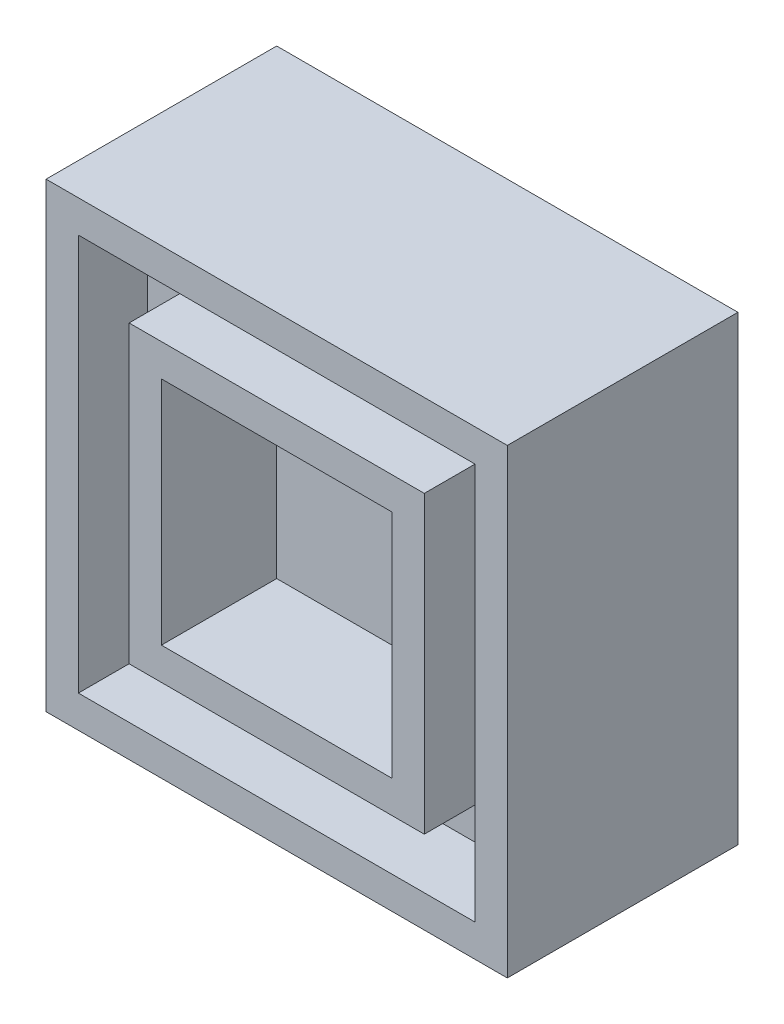
ISO-10303-21;
HEADER;
FILE_DESCRIPTION(('STEP AP214'),'2;1');
FILE_NAME('part.step','',(''),(''),'','','');
FILE_SCHEMA(('AUTOMOTIVE_DESIGN { 1 0 10303 214 1 1 1 1 }'));
ENDSEC;
DATA;
#1=APPLICATION_CONTEXT('core data for automotive mechanical design processes');
#2=APPLICATION_PROTOCOL_DEFINITION('international standard','automotive_design',2000,#1);
#3=PRODUCT_CONTEXT('',#1,'mechanical');
#4=PRODUCT('Part','Part','',(#3));
#5=PRODUCT_RELATED_PRODUCT_CATEGORY('part','',(#4));
#6=PRODUCT_DEFINITION_FORMATION('','',#4);
#7=PRODUCT_DEFINITION_CONTEXT('part definition',#1,'design');
#8=PRODUCT_DEFINITION('design','',#6,#7);
#9=PRODUCT_DEFINITION_SHAPE('','',#8);
#10=(LENGTH_UNIT() NAMED_UNIT(*) SI_UNIT(.MILLI.,.METRE.));
#11=(NAMED_UNIT(*) PLANE_ANGLE_UNIT() SI_UNIT($,.RADIAN.));
#12=(NAMED_UNIT(*) SI_UNIT($,.STERADIAN.) SOLID_ANGLE_UNIT());
#13=UNCERTAINTY_MEASURE_WITH_UNIT(LENGTH_MEASURE(1.E-05),#10,'distance_accuracy_value','');
#14=(GEOMETRIC_REPRESENTATION_CONTEXT(3) GLOBAL_UNCERTAINTY_ASSIGNED_CONTEXT((#13)) GLOBAL_UNIT_ASSIGNED_CONTEXT((#10,
#11,#12)) REPRESENTATION_CONTEXT('',''));
#15=CARTESIAN_POINT('',(0.,0.,0.));
#16=DIRECTION('',(0.,0.,1.));
#17=DIRECTION('',(1.,0.,0.));
#18=AXIS2_PLACEMENT_3D('',#15,#16,#17);
#19=CARTESIAN_POINT('',(0.,0.,10.));
#20=DIRECTION('',(0.,0.,-1.));
#21=DIRECTION('',(-1.,0.,0.));
#22=AXIS2_PLACEMENT_3D('',#19,#20,#21);
#23=PLANE('',#22);
#24=DIRECTION('',(-1.,0.,0.));
#25=VECTOR('',#24,1.);
#26=CARTESIAN_POINT('',(-8.6,8.6,10.));
#27=LINE('',#26,#25);
#28=CARTESIAN_POINT('',(8.6,8.6,10.));
#29=VERTEX_POINT('',#28);
#30=CARTESIAN_POINT('',(-8.6,8.6,10.));
#31=VERTEX_POINT('',#30);
#32=EDGE_CURVE('E236',#29,#31,#27,.T.);
#33=ORIENTED_EDGE('',*,*,#32,.F.);
#34=DIRECTION('',(0.,1.,0.));
#35=VECTOR('',#34,1.);
#36=CARTESIAN_POINT('',(8.6,-8.6,10.));
#37=LINE('',#36,#35);
#38=CARTESIAN_POINT('',(8.6,-8.6,10.));
#39=VERTEX_POINT('',#38);
#40=EDGE_CURVE('E63',#39,#29,#37,.T.);
#41=ORIENTED_EDGE('',*,*,#40,.F.);
#42=DIRECTION('',(1.,0.,0.));
#43=VECTOR('',#42,1.);
#44=CARTESIAN_POINT('',(-8.6,-8.6,10.));
#45=LINE('',#44,#43);
#46=CARTESIAN_POINT('',(-8.6,-8.6,10.));
#47=VERTEX_POINT('',#46);
#48=EDGE_CURVE('E222',#47,#39,#45,.T.);
#49=ORIENTED_EDGE('',*,*,#48,.F.);
#50=DIRECTION('',(0.,-1.,0.));
#51=VECTOR('',#50,1.);
#52=CARTESIAN_POINT('',(-8.6,-8.6,10.));
#53=LINE('',#52,#51);
#54=EDGE_CURVE('E240',#31,#47,#53,.T.);
#55=ORIENTED_EDGE('',*,*,#54,.F.);
#56=EDGE_LOOP('',(#33,#41,#49,#55));
#57=FACE_BOUND('',#56,.T.);
#58=DIRECTION('',(0.,1.,0.));
#59=VECTOR('',#58,1.);
#60=CARTESIAN_POINT('',(10.,-10.,10.));
#61=LINE('',#60,#59);
#62=CARTESIAN_POINT('',(10.,-10.,10.));
#63=VERTEX_POINT('',#62);
#64=CARTESIAN_POINT('',(10.,10.,10.));
#65=VERTEX_POINT('',#64);
#66=EDGE_CURVE('E300',#63,#65,#61,.T.);
#67=ORIENTED_EDGE('',*,*,#66,.T.);
#68=DIRECTION('',(-1.,0.,0.));
#69=VECTOR('',#68,1.);
#70=CARTESIAN_POINT('',(-10.,10.,10.));
#71=LINE('',#70,#69);
#72=CARTESIAN_POINT('',(-10.,10.,10.));
#73=VERTEX_POINT('',#72);
#74=EDGE_CURVE('E304',#65,#73,#71,.T.);
#75=ORIENTED_EDGE('',*,*,#74,.T.);
#76=DIRECTION('',(0.,-1.,0.));
#77=VECTOR('',#76,1.);
#78=CARTESIAN_POINT('',(-10.,-10.,10.));
#79=LINE('',#78,#77);
#80=CARTESIAN_POINT('',(-10.,-10.,10.));
#81=VERTEX_POINT('',#80);
#82=EDGE_CURVE('E308',#73,#81,#79,.T.);
#83=ORIENTED_EDGE('',*,*,#82,.T.);
#84=DIRECTION('',(1.,0.,0.));
#85=VECTOR('',#84,1.);
#86=CARTESIAN_POINT('',(-10.,-10.,10.));
#87=LINE('',#86,#85);
#88=EDGE_CURVE('E311',#81,#63,#87,.T.);
#89=ORIENTED_EDGE('',*,*,#88,.T.);
#90=EDGE_LOOP('',(#67,#75,#83,#89));
#91=FACE_BOUND('',#90,.T.);
#92=ADVANCED_FACE('F47',(#57,#91),#23,.F.);
#93=CARTESIAN_POINT('',(10.,-10.,10.));
#94=DIRECTION('',(-1.,0.,0.));
#95=DIRECTION('',(0.,0.,1.));
#96=AXIS2_PLACEMENT_3D('',#93,#94,#95);
#97=PLANE('',#96);
#98=DIRECTION('',(0.,1.,0.));
#99=VECTOR('',#98,1.);
#100=CARTESIAN_POINT('',(10.,-10.,0.));
#101=LINE('',#100,#99);
#102=CARTESIAN_POINT('',(10.,-10.,0.));
#103=VERTEX_POINT('',#102);
#104=CARTESIAN_POINT('',(10.,10.,0.));
#105=VERTEX_POINT('',#104);
#106=EDGE_CURVE('E267',#103,#105,#101,.T.);
#107=ORIENTED_EDGE('',*,*,#106,.T.);
#108=DIRECTION('',(0.,0.,-1.));
#109=VECTOR('',#108,1.);
#110=CARTESIAN_POINT('',(10.,10.,10.));
#111=LINE('',#110,#109);
#112=EDGE_CURVE('E11',#65,#105,#111,.T.);
#113=ORIENTED_EDGE('',*,*,#112,.F.);
#114=ORIENTED_EDGE('',*,*,#66,.F.);
#115=DIRECTION('',(0.,0.,-1.));
#116=VECTOR('',#115,1.);
#117=CARTESIAN_POINT('',(10.,-10.,10.));
#118=LINE('',#117,#116);
#119=EDGE_CURVE('E314',#63,#103,#118,.T.);
#120=ORIENTED_EDGE('',*,*,#119,.T.);
#121=EDGE_LOOP('',(#107,#113,#114,#120));
#122=FACE_BOUND('',#121,.T.);
#123=ADVANCED_FACE('F49',(#122),#97,.F.);
#124=CARTESIAN_POINT('',(-10.,10.,10.));
#125=DIRECTION('',(0.,-1.,0.));
#126=DIRECTION('',(0.,0.,-1.));
#127=AXIS2_PLACEMENT_3D('',#124,#125,#126);
#128=PLANE('',#127);
#129=DIRECTION('',(-1.,0.,0.));
#130=VECTOR('',#129,1.);
#131=CARTESIAN_POINT('',(-10.,10.,0.));
#132=LINE('',#131,#130);
#133=CARTESIAN_POINT('',(-10.,10.,0.));
#134=VERTEX_POINT('',#133);
#135=EDGE_CURVE('E318',#105,#134,#132,.T.);
#136=ORIENTED_EDGE('',*,*,#135,.T.);
#137=DIRECTION('',(0.,0.,-1.));
#138=VECTOR('',#137,1.);
#139=CARTESIAN_POINT('',(-10.,10.,10.));
#140=LINE('',#139,#138);
#141=EDGE_CURVE('E56',#73,#134,#140,.T.);
#142=ORIENTED_EDGE('',*,*,#141,.F.);
#143=ORIENTED_EDGE('',*,*,#74,.F.);
#144=ORIENTED_EDGE('',*,*,#112,.T.);
#145=EDGE_LOOP('',(#136,#142,#143,#144));
#146=FACE_BOUND('',#145,.T.);
#147=ADVANCED_FACE('F354',(#146),#128,.F.);
#148=CARTESIAN_POINT('',(-10.,-10.,10.));
#149=DIRECTION('',(1.,0.,0.));
#150=DIRECTION('',(0.,0.,-1.));
#151=AXIS2_PLACEMENT_3D('',#148,#149,#150);
#152=PLANE('',#151);
#153=DIRECTION('',(0.,-1.,0.));
#154=VECTOR('',#153,1.);
#155=CARTESIAN_POINT('',(-10.,-10.,0.));
#156=LINE('',#155,#154);
#157=CARTESIAN_POINT('',(-10.,-10.,0.));
#158=VERTEX_POINT('',#157);
#159=EDGE_CURVE('E321',#134,#158,#156,.T.);
#160=ORIENTED_EDGE('',*,*,#159,.T.);
#161=DIRECTION('',(0.,0.,-1.));
#162=VECTOR('',#161,1.);
#163=CARTESIAN_POINT('',(-10.,-10.,10.));
#164=LINE('',#163,#162);
#165=EDGE_CURVE('E329',#81,#158,#164,.T.);
#166=ORIENTED_EDGE('',*,*,#165,.F.);
#167=ORIENTED_EDGE('',*,*,#82,.F.);
#168=ORIENTED_EDGE('',*,*,#141,.T.);
#169=EDGE_LOOP('',(#160,#166,#167,#168));
#170=FACE_BOUND('',#169,.T.);
#171=ADVANCED_FACE('F339',(#170),#152,.F.);
#172=CARTESIAN_POINT('',(-10.,-10.,10.));
#173=DIRECTION('',(0.,1.,0.));
#174=DIRECTION('',(0.,0.,1.));
#175=AXIS2_PLACEMENT_3D('',#172,#173,#174);
#176=PLANE('',#175);
#177=DIRECTION('',(1.,0.,0.));
#178=VECTOR('',#177,1.);
#179=CARTESIAN_POINT('',(-10.,-10.,0.));
#180=LINE('',#179,#178);
#181=EDGE_CURVE('E305',#158,#103,#180,.T.);
#182=ORIENTED_EDGE('',*,*,#181,.T.);
#183=ORIENTED_EDGE('',*,*,#119,.F.);
#184=ORIENTED_EDGE('',*,*,#88,.F.);
#185=ORIENTED_EDGE('',*,*,#165,.T.);
#186=EDGE_LOOP('',(#182,#183,#184,#185));
#187=FACE_BOUND('',#186,.T.);
#188=ADVANCED_FACE('F348',(#187),#176,.F.);
#189=CARTESIAN_POINT('',(0.,0.,0.));
#190=DIRECTION('',(0.,0.,-1.));
#191=DIRECTION('',(-1.,0.,0.));
#192=AXIS2_PLACEMENT_3D('',#189,#190,#191);
#193=PLANE('',#192);
#194=ORIENTED_EDGE('',*,*,#106,.F.);
#195=ORIENTED_EDGE('',*,*,#181,.F.);
#196=ORIENTED_EDGE('',*,*,#159,.F.);
#197=ORIENTED_EDGE('',*,*,#135,.F.);
#198=EDGE_LOOP('',(#194,#195,#196,#197));
#199=FACE_BOUND('',#198,.T.);
#200=ADVANCED_FACE('F345',(#199),#193,.T.);
#201=CARTESIAN_POINT('',(8.6,-8.6,7.));
#202=DIRECTION('',(1.,0.,0.));
#203=DIRECTION('',(0.,0.,-1.));
#204=AXIS2_PLACEMENT_3D('',#201,#202,#203);
#205=PLANE('',#204);
#206=ORIENTED_EDGE('',*,*,#40,.T.);
#207=DIRECTION('',(0.,0.,1.));
#208=VECTOR('',#207,1.);
#209=CARTESIAN_POINT('',(8.6,8.6,7.));
#210=LINE('',#209,#208);
#211=CARTESIAN_POINT('',(8.6,8.6,7.));
#212=VERTEX_POINT('',#211);
#213=EDGE_CURVE('E233',#212,#29,#210,.T.);
#214=ORIENTED_EDGE('',*,*,#213,.F.);
#215=DIRECTION('',(0.,1.,0.));
#216=VECTOR('',#215,1.);
#217=CARTESIAN_POINT('',(8.6,-8.6,7.));
#218=LINE('',#217,#216);
#219=CARTESIAN_POINT('',(8.6,-8.6,7.));
#220=VERTEX_POINT('',#219);
#221=EDGE_CURVE('E217',#220,#212,#218,.T.);
#222=ORIENTED_EDGE('',*,*,#221,.F.);
#223=DIRECTION('',(0.,0.,1.));
#224=VECTOR('',#223,1.);
#225=CARTESIAN_POINT('',(8.6,-8.6,7.));
#226=LINE('',#225,#224);
#227=EDGE_CURVE('E247',#220,#39,#226,.T.);
#228=ORIENTED_EDGE('',*,*,#227,.T.);
#229=EDGE_LOOP('',(#206,#214,#222,#228));
#230=FACE_BOUND('',#229,.T.);
#231=ADVANCED_FACE('F406',(#230),#205,.F.);
#232=CARTESIAN_POINT('',(-8.6,-8.6,7.));
#233=DIRECTION('',(0.,-1.,0.));
#234=DIRECTION('',(0.,0.,-1.));
#235=AXIS2_PLACEMENT_3D('',#232,#233,#234);
#236=PLANE('',#235);
#237=ORIENTED_EDGE('',*,*,#48,.T.);
#238=ORIENTED_EDGE('',*,*,#227,.F.);
#239=DIRECTION('',(1.,0.,0.));
#240=VECTOR('',#239,1.);
#241=CARTESIAN_POINT('',(-8.6,-8.6,7.));
#242=LINE('',#241,#240);
#243=CARTESIAN_POINT('',(-8.6,-8.6,7.));
#244=VERTEX_POINT('',#243);
#245=EDGE_CURVE('E230',#244,#220,#242,.T.);
#246=ORIENTED_EDGE('',*,*,#245,.F.);
#247=DIRECTION('',(0.,0.,1.));
#248=VECTOR('',#247,1.);
#249=CARTESIAN_POINT('',(-8.6,-8.6,7.));
#250=LINE('',#249,#248);
#251=EDGE_CURVE('E251',#244,#47,#250,.T.);
#252=ORIENTED_EDGE('',*,*,#251,.T.);
#253=EDGE_LOOP('',(#237,#238,#246,#252));
#254=FACE_BOUND('',#253,.T.);
#255=ADVANCED_FACE('F402',(#254),#236,.F.);
#256=CARTESIAN_POINT('',(-8.6,-8.6,7.));
#257=DIRECTION('',(-1.,0.,0.));
#258=DIRECTION('',(0.,0.,1.));
#259=AXIS2_PLACEMENT_3D('',#256,#257,#258);
#260=PLANE('',#259);
#261=ORIENTED_EDGE('',*,*,#54,.T.);
#262=ORIENTED_EDGE('',*,*,#251,.F.);
#263=DIRECTION('',(0.,-1.,0.));
#264=VECTOR('',#263,1.);
#265=CARTESIAN_POINT('',(-8.6,-8.6,7.));
#266=LINE('',#265,#264);
#267=CARTESIAN_POINT('',(-8.6,8.6,7.));
#268=VERTEX_POINT('',#267);
#269=EDGE_CURVE('E226',#268,#244,#266,.T.);
#270=ORIENTED_EDGE('',*,*,#269,.F.);
#271=DIRECTION('',(0.,0.,1.));
#272=VECTOR('',#271,1.);
#273=CARTESIAN_POINT('',(-8.6,8.6,7.));
#274=LINE('',#273,#272);
#275=EDGE_CURVE('E254',#268,#31,#274,.T.);
#276=ORIENTED_EDGE('',*,*,#275,.T.);
#277=EDGE_LOOP('',(#261,#262,#270,#276));
#278=FACE_BOUND('',#277,.T.);
#279=ADVANCED_FACE('F405',(#278),#260,.F.);
#280=CARTESIAN_POINT('',(-8.6,8.6,7.));
#281=DIRECTION('',(0.,1.,0.));
#282=DIRECTION('',(0.,0.,1.));
#283=AXIS2_PLACEMENT_3D('',#280,#281,#282);
#284=PLANE('',#283);
#285=ORIENTED_EDGE('',*,*,#32,.T.);
#286=ORIENTED_EDGE('',*,*,#275,.F.);
#287=DIRECTION('',(-1.,0.,0.));
#288=VECTOR('',#287,1.);
#289=CARTESIAN_POINT('',(-8.6,8.6,7.));
#290=LINE('',#289,#288);
#291=EDGE_CURVE('E221',#212,#268,#290,.T.);
#292=ORIENTED_EDGE('',*,*,#291,.F.);
#293=ORIENTED_EDGE('',*,*,#213,.T.);
#294=EDGE_LOOP('',(#285,#286,#292,#293));
#295=FACE_BOUND('',#294,.T.);
#296=ADVANCED_FACE('F401',(#295),#284,.F.);
#297=CARTESIAN_POINT('',(0.,0.,7.));
#298=DIRECTION('',(0.,0.,-1.));
#299=DIRECTION('',(-1.,0.,0.));
#300=AXIS2_PLACEMENT_3D('',#297,#298,#299);
#301=PLANE('',#300);
#302=DIRECTION('',(0.,1.,0.));
#303=VECTOR('',#302,1.);
#304=CARTESIAN_POINT('',(6.4,-6.4,7.));
#305=LINE('',#304,#303);
#306=CARTESIAN_POINT('',(6.4,-6.4,7.));
#307=VERTEX_POINT('',#306);
#308=CARTESIAN_POINT('',(6.4,6.4,7.));
#309=VERTEX_POINT('',#308);
#310=EDGE_CURVE('E181',#307,#309,#305,.T.);
#311=ORIENTED_EDGE('',*,*,#310,.F.);
#312=DIRECTION('',(1.,0.,0.));
#313=VECTOR('',#312,1.);
#314=CARTESIAN_POINT('',(-6.4,-6.4,7.));
#315=LINE('',#314,#313);
#316=CARTESIAN_POINT('',(-6.4,-6.4,7.));
#317=VERTEX_POINT('',#316);
#318=EDGE_CURVE('E174',#317,#307,#315,.T.);
#319=ORIENTED_EDGE('',*,*,#318,.F.);
#320=DIRECTION('',(0.,-1.,0.));
#321=VECTOR('',#320,1.);
#322=CARTESIAN_POINT('',(-6.4,-6.4,7.));
#323=LINE('',#322,#321);
#324=CARTESIAN_POINT('',(-6.4,6.4,7.));
#325=VERTEX_POINT('',#324);
#326=EDGE_CURVE('E184',#325,#317,#323,.T.);
#327=ORIENTED_EDGE('',*,*,#326,.F.);
#328=DIRECTION('',(-1.,0.,0.));
#329=VECTOR('',#328,1.);
#330=CARTESIAN_POINT('',(-6.4,6.4,7.));
#331=LINE('',#330,#329);
#332=EDGE_CURVE('E165',#309,#325,#331,.T.);
#333=ORIENTED_EDGE('',*,*,#332,.F.);
#334=EDGE_LOOP('',(#311,#319,#327,#333));
#335=FACE_BOUND('',#334,.T.);
#336=ORIENTED_EDGE('',*,*,#221,.T.);
#337=ORIENTED_EDGE('',*,*,#291,.T.);
#338=ORIENTED_EDGE('',*,*,#269,.T.);
#339=ORIENTED_EDGE('',*,*,#245,.T.);
#340=EDGE_LOOP('',(#336,#337,#338,#339));
#341=FACE_BOUND('',#340,.T.);
#342=ADVANCED_FACE('F178',(#335,#341),#301,.F.);
#343=CARTESIAN_POINT('',(6.4,-6.4,7.));
#344=DIRECTION('',(1.,0.,0.));
#345=DIRECTION('',(0.,0.,-1.));
#346=AXIS2_PLACEMENT_3D('',#343,#344,#345);
#347=PLANE('',#346);
#348=DIRECTION('',(0.,1.,0.));
#349=VECTOR('',#348,1.);
#350=CARTESIAN_POINT('',(6.4,-6.4,10.));
#351=LINE('',#350,#349);
#352=CARTESIAN_POINT('',(6.4,-6.4,10.));
#353=VERTEX_POINT('',#352);
#354=CARTESIAN_POINT('',(6.4,6.4,10.));
#355=VERTEX_POINT('',#354);
#356=EDGE_CURVE('E203',#353,#355,#351,.T.);
#357=ORIENTED_EDGE('',*,*,#356,.F.);
#358=DIRECTION('',(0.,0.,1.));
#359=VECTOR('',#358,1.);
#360=CARTESIAN_POINT('',(6.4,-6.4,7.));
#361=LINE('',#360,#359);
#362=EDGE_CURVE('E188',#307,#353,#361,.T.);
#363=ORIENTED_EDGE('',*,*,#362,.F.);
#364=ORIENTED_EDGE('',*,*,#310,.T.);
#365=DIRECTION('',(0.,0.,1.));
#366=VECTOR('',#365,1.);
#367=CARTESIAN_POINT('',(6.4,6.4,7.));
#368=LINE('',#367,#366);
#369=EDGE_CURVE('E162',#309,#355,#368,.T.);
#370=ORIENTED_EDGE('',*,*,#369,.T.);
#371=EDGE_LOOP('',(#357,#363,#364,#370));
#372=FACE_BOUND('',#371,.T.);
#373=ADVANCED_FACE('F187',(#372),#347,.T.);
#374=CARTESIAN_POINT('',(-6.4,-6.4,7.));
#375=DIRECTION('',(0.,-1.,0.));
#376=DIRECTION('',(0.,0.,-1.));
#377=AXIS2_PLACEMENT_3D('',#374,#375,#376);
#378=PLANE('',#377);
#379=DIRECTION('',(1.,0.,0.));
#380=VECTOR('',#379,1.);
#381=CARTESIAN_POINT('',(-6.4,-6.4,10.));
#382=LINE('',#381,#380);
#383=CARTESIAN_POINT('',(-6.4,-6.4,10.));
#384=VERTEX_POINT('',#383);
#385=EDGE_CURVE('E190',#384,#353,#382,.T.);
#386=ORIENTED_EDGE('',*,*,#385,.F.);
#387=DIRECTION('',(0.,0.,1.));
#388=VECTOR('',#387,1.);
#389=CARTESIAN_POINT('',(-6.4,-6.4,7.));
#390=LINE('',#389,#388);
#391=EDGE_CURVE('E212',#317,#384,#390,.T.);
#392=ORIENTED_EDGE('',*,*,#391,.F.);
#393=ORIENTED_EDGE('',*,*,#318,.T.);
#394=ORIENTED_EDGE('',*,*,#362,.T.);
#395=EDGE_LOOP('',(#386,#392,#393,#394));
#396=FACE_BOUND('',#395,.T.);
#397=ADVANCED_FACE('F385',(#396),#378,.T.);
#398=CARTESIAN_POINT('',(-6.4,-6.4,7.));
#399=DIRECTION('',(-1.,0.,0.));
#400=DIRECTION('',(0.,0.,1.));
#401=AXIS2_PLACEMENT_3D('',#398,#399,#400);
#402=PLANE('',#401);
#403=DIRECTION('',(0.,-1.,0.));
#404=VECTOR('',#403,1.);
#405=CARTESIAN_POINT('',(-6.4,-6.4,10.));
#406=LINE('',#405,#404);
#407=CARTESIAN_POINT('',(-6.4,6.4,10.));
#408=VERTEX_POINT('',#407);
#409=EDGE_CURVE('E71',#408,#384,#406,.T.);
#410=ORIENTED_EDGE('',*,*,#409,.F.);
#411=DIRECTION('',(0.,0.,1.));
#412=VECTOR('',#411,1.);
#413=CARTESIAN_POINT('',(-6.4,6.4,7.));
#414=LINE('',#413,#412);
#415=EDGE_CURVE('E173',#325,#408,#414,.T.);
#416=ORIENTED_EDGE('',*,*,#415,.F.);
#417=ORIENTED_EDGE('',*,*,#326,.T.);
#418=ORIENTED_EDGE('',*,*,#391,.T.);
#419=EDGE_LOOP('',(#410,#416,#417,#418));
#420=FACE_BOUND('',#419,.T.);
#421=ADVANCED_FACE('F386',(#420),#402,.T.);
#422=CARTESIAN_POINT('',(-6.4,6.4,7.));
#423=DIRECTION('',(0.,1.,0.));
#424=DIRECTION('',(0.,0.,1.));
#425=AXIS2_PLACEMENT_3D('',#422,#423,#424);
#426=PLANE('',#425);
#427=DIRECTION('',(-1.,0.,0.));
#428=VECTOR('',#427,1.);
#429=CARTESIAN_POINT('',(-6.4,6.4,10.));
#430=LINE('',#429,#428);
#431=EDGE_CURVE('E167',#355,#408,#430,.T.);
#432=ORIENTED_EDGE('',*,*,#431,.F.);
#433=ORIENTED_EDGE('',*,*,#369,.F.);
#434=ORIENTED_EDGE('',*,*,#332,.T.);
#435=ORIENTED_EDGE('',*,*,#415,.T.);
#436=EDGE_LOOP('',(#432,#433,#434,#435));
#437=FACE_BOUND('',#436,.T.);
#438=ADVANCED_FACE('F164',(#437),#426,.T.);
#439=CARTESIAN_POINT('',(0.,0.,5.));
#440=DIRECTION('',(0.,0.,-1.));
#441=DIRECTION('',(-1.,0.,0.));
#442=AXIS2_PLACEMENT_3D('',#439,#440,#441);
#443=PLANE('',#442);
#444=DIRECTION('',(0.,1.,0.));
#445=VECTOR('',#444,1.);
#446=CARTESIAN_POINT('',(5.,0.,5.));
#447=LINE('',#446,#445);
#448=CARTESIAN_POINT('',(5.,-5.,5.));
#449=VERTEX_POINT('',#448);
#450=CARTESIAN_POINT('',(5.,5.,5.));
#451=VERTEX_POINT('',#450);
#452=EDGE_CURVE('E250',#449,#451,#447,.T.);
#453=ORIENTED_EDGE('',*,*,#452,.T.);
#454=DIRECTION('',(-1.,0.,0.));
#455=VECTOR('',#454,1.);
#456=CARTESIAN_POINT('',(0.,5.,5.));
#457=LINE('',#456,#455);
#458=CARTESIAN_POINT('',(-5.,5.,5.));
#459=VERTEX_POINT('',#458);
#460=EDGE_CURVE('E262',#451,#459,#457,.T.);
#461=ORIENTED_EDGE('',*,*,#460,.T.);
#462=DIRECTION('',(0.,-1.,0.));
#463=VECTOR('',#462,1.);
#464=CARTESIAN_POINT('',(-5.,0.,5.));
#465=LINE('',#464,#463);
#466=CARTESIAN_POINT('',(-5.,-5.,5.));
#467=VERTEX_POINT('',#466);
#468=EDGE_CURVE('E277',#459,#467,#465,.T.);
#469=ORIENTED_EDGE('',*,*,#468,.T.);
#470=DIRECTION('',(1.,0.,0.));
#471=VECTOR('',#470,1.);
#472=CARTESIAN_POINT('',(0.,-5.,5.));
#473=LINE('',#472,#471);
#474=EDGE_CURVE('E283',#467,#449,#473,.T.);
#475=ORIENTED_EDGE('',*,*,#474,.T.);
#476=EDGE_LOOP('',(#453,#461,#469,#475));
#477=FACE_BOUND('',#476,.T.);
#478=ADVANCED_FACE('F393',(#477),#443,.F.);
#479=CARTESIAN_POINT('',(-10.,5.,10.));
#480=DIRECTION('',(0.,-1.,0.));
#481=DIRECTION('',(0.,0.,-1.));
#482=AXIS2_PLACEMENT_3D('',#479,#480,#481);
#483=PLANE('',#482);
#484=ORIENTED_EDGE('',*,*,#460,.F.);
#485=DIRECTION('',(0.,0.,-1.));
#486=VECTOR('',#485,1.);
#487=CARTESIAN_POINT('',(5.,5.,10.));
#488=LINE('',#487,#486);
#489=CARTESIAN_POINT('',(5.,5.,10.));
#490=VERTEX_POINT('',#489);
#491=EDGE_CURVE('E263',#490,#451,#488,.T.);
#492=ORIENTED_EDGE('',*,*,#491,.F.);
#493=DIRECTION('',(-1.,0.,0.));
#494=VECTOR('',#493,1.);
#495=CARTESIAN_POINT('',(0.,5.,10.));
#496=LINE('',#495,#494);
#497=CARTESIAN_POINT('',(-5.,5.,10.));
#498=VERTEX_POINT('',#497);
#499=EDGE_CURVE('E291',#490,#498,#496,.T.);
#500=ORIENTED_EDGE('',*,*,#499,.T.);
#501=DIRECTION('',(0.,0.,-1.));
#502=VECTOR('',#501,1.);
#503=CARTESIAN_POINT('',(-5.,5.,10.));
#504=LINE('',#503,#502);
#505=EDGE_CURVE('E268',#498,#459,#504,.T.);
#506=ORIENTED_EDGE('',*,*,#505,.T.);
#507=EDGE_LOOP('',(#484,#492,#500,#506));
#508=FACE_BOUND('',#507,.T.);
#509=ADVANCED_FACE('F416',(#508),#483,.T.);
#510=CARTESIAN_POINT('',(-5.,-10.,10.));
#511=DIRECTION('',(1.,0.,0.));
#512=DIRECTION('',(0.,0.,-1.));
#513=AXIS2_PLACEMENT_3D('',#510,#511,#512);
#514=PLANE('',#513);
#515=ORIENTED_EDGE('',*,*,#468,.F.);
#516=ORIENTED_EDGE('',*,*,#505,.F.);
#517=DIRECTION('',(0.,-1.,0.));
#518=VECTOR('',#517,1.);
#519=CARTESIAN_POINT('',(-5.,0.,10.));
#520=LINE('',#519,#518);
#521=CARTESIAN_POINT('',(-5.,-5.,10.));
#522=VERTEX_POINT('',#521);
#523=EDGE_CURVE('E294',#498,#522,#520,.T.);
#524=ORIENTED_EDGE('',*,*,#523,.T.);
#525=DIRECTION('',(0.,0.,-1.));
#526=VECTOR('',#525,1.);
#527=CARTESIAN_POINT('',(-5.,-5.,10.));
#528=LINE('',#527,#526);
#529=EDGE_CURVE('E273',#522,#467,#528,.T.);
#530=ORIENTED_EDGE('',*,*,#529,.T.);
#531=EDGE_LOOP('',(#515,#516,#524,#530));
#532=FACE_BOUND('',#531,.T.);
#533=ADVANCED_FACE('F419',(#532),#514,.T.);
#534=CARTESIAN_POINT('',(-10.,-5.,10.));
#535=DIRECTION('',(0.,1.,0.));
#536=DIRECTION('',(0.,0.,1.));
#537=AXIS2_PLACEMENT_3D('',#534,#535,#536);
#538=PLANE('',#537);
#539=ORIENTED_EDGE('',*,*,#474,.F.);
#540=ORIENTED_EDGE('',*,*,#529,.F.);
#541=DIRECTION('',(1.,0.,0.));
#542=VECTOR('',#541,1.);
#543=CARTESIAN_POINT('',(0.,-5.,10.));
#544=LINE('',#543,#542);
#545=CARTESIAN_POINT('',(5.,-5.,10.));
#546=VERTEX_POINT('',#545);
#547=EDGE_CURVE('E274',#522,#546,#544,.T.);
#548=ORIENTED_EDGE('',*,*,#547,.T.);
#549=DIRECTION('',(0.,0.,-1.));
#550=VECTOR('',#549,1.);
#551=CARTESIAN_POINT('',(5.,-5.,10.));
#552=LINE('',#551,#550);
#553=EDGE_CURVE('E269',#546,#449,#552,.T.);
#554=ORIENTED_EDGE('',*,*,#553,.T.);
#555=EDGE_LOOP('',(#539,#540,#548,#554));
#556=FACE_BOUND('',#555,.T.);
#557=ADVANCED_FACE('F376',(#556),#538,.T.);
#558=CARTESIAN_POINT('',(5.,-10.,10.));
#559=DIRECTION('',(-1.,0.,0.));
#560=DIRECTION('',(0.,0.,1.));
#561=AXIS2_PLACEMENT_3D('',#558,#559,#560);
#562=PLANE('',#561);
#563=ORIENTED_EDGE('',*,*,#452,.F.);
#564=ORIENTED_EDGE('',*,*,#553,.F.);
#565=DIRECTION('',(0.,1.,0.));
#566=VECTOR('',#565,1.);
#567=CARTESIAN_POINT('',(5.,0.,10.));
#568=LINE('',#567,#566);
#569=EDGE_CURVE('E289',#546,#490,#568,.T.);
#570=ORIENTED_EDGE('',*,*,#569,.T.);
#571=ORIENTED_EDGE('',*,*,#491,.T.);
#572=EDGE_LOOP('',(#563,#564,#570,#571));
#573=FACE_BOUND('',#572,.T.);
#574=ADVANCED_FACE('F371',(#573),#562,.T.);
#575=ORIENTED_EDGE('',*,*,#569,.F.);
#576=ORIENTED_EDGE('',*,*,#547,.F.);
#577=ORIENTED_EDGE('',*,*,#523,.F.);
#578=ORIENTED_EDGE('',*,*,#499,.F.);
#579=EDGE_LOOP('',(#575,#576,#577,#578));
#580=FACE_BOUND('',#579,.T.);
#581=ORIENTED_EDGE('',*,*,#356,.T.);
#582=ORIENTED_EDGE('',*,*,#431,.T.);
#583=ORIENTED_EDGE('',*,*,#409,.T.);
#584=ORIENTED_EDGE('',*,*,#385,.T.);
#585=EDGE_LOOP('',(#581,#582,#583,#584));
#586=FACE_BOUND('',#585,.T.);
#587=ADVANCED_FACE('F364',(#580,#586),#23,.F.);
#588=CLOSED_SHELL('',(#92,#123,#147,#171,#188,#200,#231,#255,#279,#296,#342,#373,#397,#421,#438,
#478,#509,#533,#557,#574,#587));
#589=MANIFOLD_SOLID_BREP('B2',#588);
#590=ADVANCED_BREP_SHAPE_REPRESENTATION('',(#18,#589),#14);
#591=SHAPE_DEFINITION_REPRESENTATION(#9,#590);
ENDSEC;
END-ISO-10303-21;
